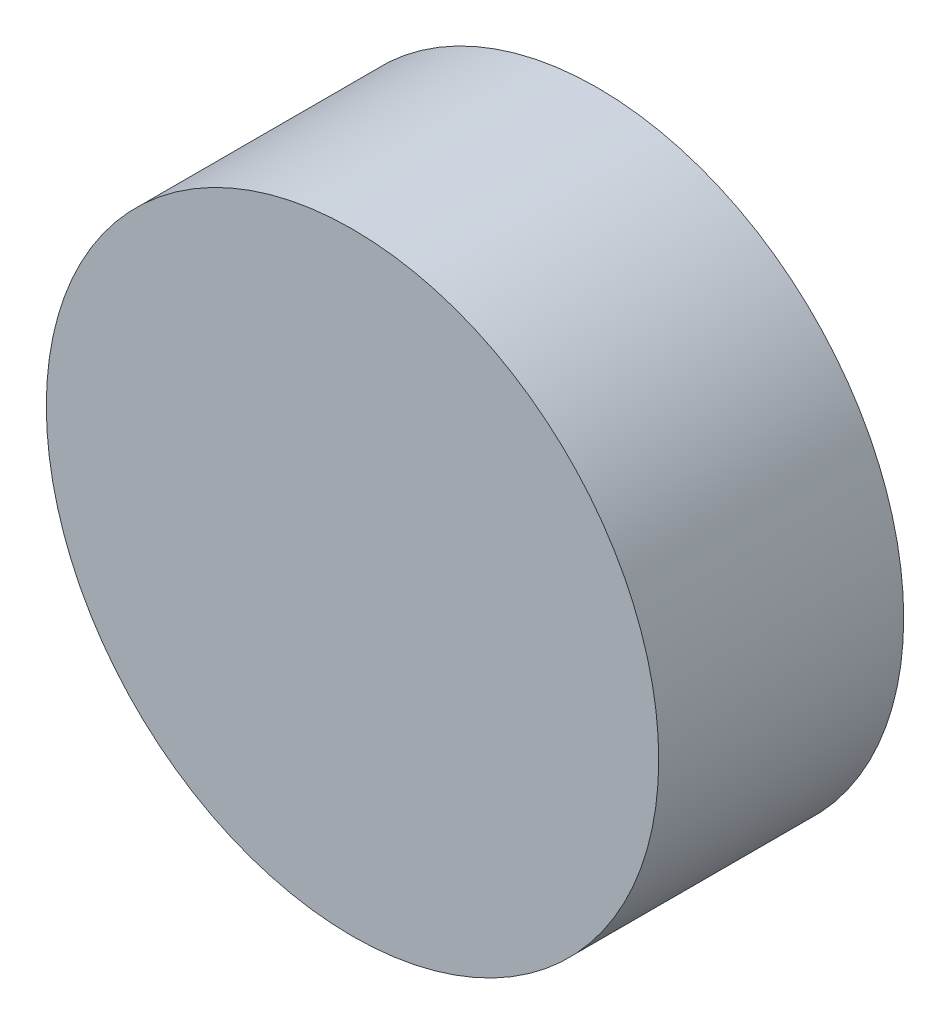
ISO-10303-21;
HEADER;
FILE_DESCRIPTION(('STEP AP214'),'2;1');
FILE_NAME('part.step','',(''),(''),'','','');
FILE_SCHEMA(('AUTOMOTIVE_DESIGN { 1 0 10303 214 1 1 1 1 }'));
ENDSEC;
DATA;
#1=APPLICATION_CONTEXT('core data for automotive mechanical design processes');
#2=APPLICATION_PROTOCOL_DEFINITION('international standard','automotive_design',2000,#1);
#3=PRODUCT_CONTEXT('',#1,'mechanical');
#4=PRODUCT('Part','Part','',(#3));
#5=PRODUCT_RELATED_PRODUCT_CATEGORY('part','',(#4));
#6=PRODUCT_DEFINITION_FORMATION('','',#4);
#7=PRODUCT_DEFINITION_CONTEXT('part definition',#1,'design');
#8=PRODUCT_DEFINITION('design','',#6,#7);
#9=PRODUCT_DEFINITION_SHAPE('','',#8);
#10=(LENGTH_UNIT() NAMED_UNIT(*) SI_UNIT(.MILLI.,.METRE.));
#11=(NAMED_UNIT(*) PLANE_ANGLE_UNIT() SI_UNIT($,.RADIAN.));
#12=(NAMED_UNIT(*) SI_UNIT($,.STERADIAN.) SOLID_ANGLE_UNIT());
#13=UNCERTAINTY_MEASURE_WITH_UNIT(LENGTH_MEASURE(1.E-05),#10,'distance_accuracy_value','');
#14=(GEOMETRIC_REPRESENTATION_CONTEXT(3) GLOBAL_UNCERTAINTY_ASSIGNED_CONTEXT((#13)) GLOBAL_UNIT_ASSIGNED_CONTEXT((#10,
#11,#12)) REPRESENTATION_CONTEXT('',''));
#15=CARTESIAN_POINT('',(0.,0.,0.));
#16=DIRECTION('',(0.,0.,1.));
#17=DIRECTION('',(1.,0.,0.));
#18=AXIS2_PLACEMENT_3D('',#15,#16,#17);
#19=CARTESIAN_POINT('',(0.,0.,20.));
#20=DIRECTION('',(0.,0.,1.));
#21=DIRECTION('',(1.,0.,0.));
#22=AXIS2_PLACEMENT_3D('',#19,#20,#21);
#23=PLANE('',#22);
#24=CARTESIAN_POINT('',(0.,0.,20.));
#25=DIRECTION('',(0.,0.,-1.));
#26=DIRECTION('',(-1.,0.,0.));
#27=AXIS2_PLACEMENT_3D('',#24,#25,#26);
#28=CIRCLE('',#27,25.);
#29=CARTESIAN_POINT('',(-25.,0.,20.));
#30=VERTEX_POINT('',#29);
#31=EDGE_CURVE('E56',#30,#30,#28,.T.);
#32=ORIENTED_EDGE('',*,*,#31,.F.);
#33=EDGE_LOOP('',(#32));
#34=FACE_BOUND('',#33,.T.);
#35=ADVANCED_FACE('F39',(#34),#23,.T.);
#36=CARTESIAN_POINT('',(0.,0.,10.));
#37=DIRECTION('',(0.,0.,1.));
#38=DIRECTION('',(1.,0.,0.));
#39=AXIS2_PLACEMENT_3D('',#36,#37,#38);
#40=PLANE('',#39);
#41=CARTESIAN_POINT('',(0.,0.,10.));
#42=DIRECTION('',(0.,0.,-1.));
#43=DIRECTION('',(-1.,0.,0.));
#44=AXIS2_PLACEMENT_3D('',#41,#42,#43);
#45=CIRCLE('',#44,15.);
#46=CARTESIAN_POINT('',(-15.,0.,10.));
#47=VERTEX_POINT('',#46);
#48=EDGE_CURVE('E10',#47,#47,#45,.T.);
#49=ORIENTED_EDGE('',*,*,#48,.T.);
#50=EDGE_LOOP('',(#49));
#51=FACE_BOUND('',#50,.T.);
#52=ADVANCED_FACE('F67',(#51),#40,.F.);
#53=CARTESIAN_POINT('',(0.,0.,0.));
#54=DIRECTION('',(0.,0.,-1.));
#55=DIRECTION('',(-1.,0.,0.));
#56=AXIS2_PLACEMENT_3D('',#53,#54,#55);
#57=CYLINDRICAL_SURFACE('',#56,15.);
#58=ORIENTED_EDGE('',*,*,#48,.F.);
#59=EDGE_LOOP('',(#58));
#60=FACE_BOUND('',#59,.T.);
#61=CARTESIAN_POINT('',(0.,0.,0.));
#62=DIRECTION('',(0.,0.,-1.));
#63=DIRECTION('',(-1.,0.,0.));
#64=AXIS2_PLACEMENT_3D('',#61,#62,#63);
#65=CIRCLE('',#64,15.);
#66=CARTESIAN_POINT('',(-15.,0.,0.));
#67=VERTEX_POINT('',#66);
#68=EDGE_CURVE('E46',#67,#67,#65,.T.);
#69=ORIENTED_EDGE('',*,*,#68,.T.);
#70=EDGE_LOOP('',(#69));
#71=FACE_BOUND('',#70,.T.);
#72=ADVANCED_FACE('F71',(#60,#71),#57,.F.);
#73=CARTESIAN_POINT('',(0.,0.,0.));
#74=DIRECTION('',(0.,0.,1.));
#75=DIRECTION('',(1.,0.,0.));
#76=AXIS2_PLACEMENT_3D('',#73,#74,#75);
#77=PLANE('',#76);
#78=ORIENTED_EDGE('',*,*,#68,.F.);
#79=EDGE_LOOP('',(#78));
#80=FACE_BOUND('',#79,.T.);
#81=CARTESIAN_POINT('',(0.,0.,0.));
#82=DIRECTION('',(0.,0.,-1.));
#83=DIRECTION('',(-1.,0.,0.));
#84=AXIS2_PLACEMENT_3D('',#81,#82,#83);
#85=CIRCLE('',#84,25.);
#86=CARTESIAN_POINT('',(-25.,0.,0.));
#87=VERTEX_POINT('',#86);
#88=EDGE_CURVE('E51',#87,#87,#85,.T.);
#89=ORIENTED_EDGE('',*,*,#88,.T.);
#90=EDGE_LOOP('',(#89));
#91=FACE_BOUND('',#90,.T.);
#92=ADVANCED_FACE('F75',(#80,#91),#77,.F.);
#93=CARTESIAN_POINT('',(0.,0.,0.));
#94=DIRECTION('',(0.,0.,-1.));
#95=DIRECTION('',(-1.,0.,0.));
#96=AXIS2_PLACEMENT_3D('',#93,#94,#95);
#97=CYLINDRICAL_SURFACE('',#96,25.);
#98=ORIENTED_EDGE('',*,*,#31,.T.);
#99=EDGE_LOOP('',(#98));
#100=FACE_BOUND('',#99,.T.);
#101=ORIENTED_EDGE('',*,*,#88,.F.);
#102=EDGE_LOOP('',(#101));
#103=FACE_BOUND('',#102,.T.);
#104=ADVANCED_FACE('F63',(#100,#103),#97,.T.);
#105=CLOSED_SHELL('',(#35,#52,#72,#92,#104));
#106=MANIFOLD_SOLID_BREP('B2',#105);
#107=ADVANCED_BREP_SHAPE_REPRESENTATION('',(#18,#106),#14);
#108=SHAPE_DEFINITION_REPRESENTATION(#9,#107);
ENDSEC;
END-ISO-10303-21;
